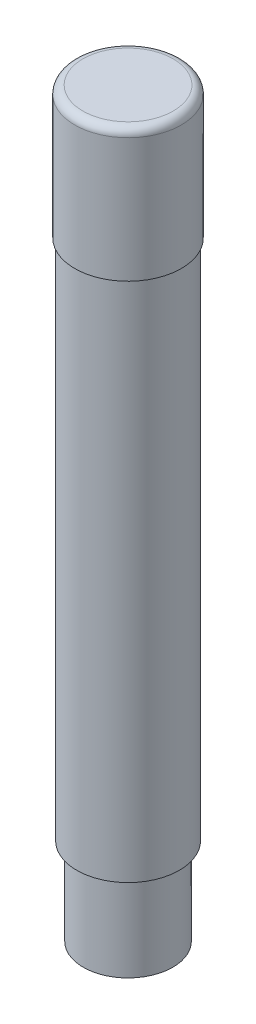
ISO-10303-21;
HEADER;
FILE_DESCRIPTION(('STEP AP214'),'2;1');
FILE_NAME('part.step','',(''),(''),'','','');
FILE_SCHEMA(('AUTOMOTIVE_DESIGN { 1 0 10303 214 1 1 1 1 }'));
ENDSEC;
DATA;
#1=APPLICATION_CONTEXT('core data for automotive mechanical design processes');
#2=APPLICATION_PROTOCOL_DEFINITION('international standard','automotive_design',2000,#1);
#3=PRODUCT_CONTEXT('',#1,'mechanical');
#4=PRODUCT('Part','Part','',(#3));
#5=PRODUCT_RELATED_PRODUCT_CATEGORY('part','',(#4));
#6=PRODUCT_DEFINITION_FORMATION('','',#4);
#7=PRODUCT_DEFINITION_CONTEXT('part definition',#1,'design');
#8=PRODUCT_DEFINITION('design','',#6,#7);
#9=PRODUCT_DEFINITION_SHAPE('','',#8);
#10=(LENGTH_UNIT() NAMED_UNIT(*) SI_UNIT(.MILLI.,.METRE.));
#11=(NAMED_UNIT(*) PLANE_ANGLE_UNIT() SI_UNIT($,.RADIAN.));
#12=(NAMED_UNIT(*) SI_UNIT($,.STERADIAN.) SOLID_ANGLE_UNIT());
#13=UNCERTAINTY_MEASURE_WITH_UNIT(LENGTH_MEASURE(1.E-05),#10,'distance_accuracy_value','');
#14=(GEOMETRIC_REPRESENTATION_CONTEXT(3) GLOBAL_UNCERTAINTY_ASSIGNED_CONTEXT((#13)) GLOBAL_UNIT_ASSIGNED_CONTEXT((#10,
#11,#12)) REPRESENTATION_CONTEXT('',''));
#15=CARTESIAN_POINT('',(0.,0.,0.));
#16=DIRECTION('',(0.,0.,1.));
#17=DIRECTION('',(1.,0.,0.));
#18=AXIS2_PLACEMENT_3D('',#15,#16,#17);
#19=CARTESIAN_POINT('',(-5.55,0.,0.));
#20=DIRECTION('',(0.,1.,0.));
#21=DIRECTION('',(0.,0.,1.));
#22=AXIS2_PLACEMENT_3D('',#19,#20,#21);
#23=PLANE('',#22);
#24=CARTESIAN_POINT('',(0.,0.,0.));
#25=DIRECTION('',(0.,-1.,0.));
#26=DIRECTION('',(0.,0.,-1.));
#27=AXIS2_PLACEMENT_3D('',#24,#25,#26);
#28=CIRCLE('',#27,5.55);
#29=CARTESIAN_POINT('',(0.,0.,-5.55));
#30=VERTEX_POINT('',#29);
#31=EDGE_CURVE('E75',#30,#30,#28,.T.);
#32=ORIENTED_EDGE('',*,*,#31,.T.);
#33=EDGE_LOOP('',(#32));
#34=FACE_BOUND('',#33,.T.);
#35=ADVANCED_FACE('F43',(#34),#23,.F.);
#36=CARTESIAN_POINT('',(0.,91.9,0.));
#37=DIRECTION('',(0.,-1.,0.));
#38=DIRECTION('',(0.,0.,-1.));
#39=AXIS2_PLACEMENT_3D('',#36,#37,#38);
#40=PLANE('',#39);
#41=CARTESIAN_POINT('',(0.,91.9,0.));
#42=DIRECTION('',(0.,-1.,0.));
#43=DIRECTION('',(0.,0.,-1.));
#44=AXIS2_PLACEMENT_3D('',#41,#42,#43);
#45=CIRCLE('',#44,5.6);
#46=CARTESIAN_POINT('',(0.,91.9,-5.6));
#47=VERTEX_POINT('',#46);
#48=EDGE_CURVE('E10',#47,#47,#45,.F.);
#49=ORIENTED_EDGE('',*,*,#48,.T.);
#50=EDGE_LOOP('',(#49));
#51=FACE_BOUND('',#50,.T.);
#52=ADVANCED_FACE('F107',(#51),#40,.F.);
#53=CARTESIAN_POINT('',(0.,0.,0.));
#54=DIRECTION('',(0.,-1.,0.));
#55=DIRECTION('',(0.,0.,-1.));
#56=AXIS2_PLACEMENT_3D('',#53,#54,#55);
#57=CYLINDRICAL_SURFACE('',#56,6.6);
#58=CARTESIAN_POINT('',(0.,90.9,0.));
#59=DIRECTION('',(0.,-1.,0.));
#60=DIRECTION('',(0.,0.,-1.));
#61=AXIS2_PLACEMENT_3D('',#58,#59,#60);
#62=CIRCLE('',#61,6.6);
#63=CARTESIAN_POINT('',(0.,90.9,-6.6));
#64=VERTEX_POINT('',#63);
#65=EDGE_CURVE('E51',#64,#64,#62,.T.);
#66=ORIENTED_EDGE('',*,*,#65,.T.);
#67=EDGE_LOOP('',(#66));
#68=FACE_BOUND('',#67,.T.);
#69=CARTESIAN_POINT('',(0.,75.5,0.));
#70=DIRECTION('',(0.,-1.,0.));
#71=DIRECTION('',(0.,0.,-1.));
#72=AXIS2_PLACEMENT_3D('',#69,#70,#71);
#73=CIRCLE('',#72,6.6);
#74=CARTESIAN_POINT('',(0.,75.5,-6.6));
#75=VERTEX_POINT('',#74);
#76=EDGE_CURVE('E56',#75,#75,#73,.T.);
#77=ORIENTED_EDGE('',*,*,#76,.F.);
#78=EDGE_LOOP('',(#77));
#79=FACE_BOUND('',#78,.T.);
#80=ADVANCED_FACE('F102',(#68,#79),#57,.T.);
#81=CARTESIAN_POINT('',(-6.6,75.5,0.));
#82=DIRECTION('',(0.,1.,0.));
#83=DIRECTION('',(0.,0.,1.));
#84=AXIS2_PLACEMENT_3D('',#81,#82,#83);
#85=PLANE('',#84);
#86=CARTESIAN_POINT('',(0.,75.5,0.));
#87=DIRECTION('',(0.,-1.,0.));
#88=DIRECTION('',(0.,0.,-1.));
#89=AXIS2_PLACEMENT_3D('',#86,#87,#88);
#90=CIRCLE('',#89,6.35);
#91=CARTESIAN_POINT('',(0.,75.5,-6.35));
#92=VERTEX_POINT('',#91);
#93=EDGE_CURVE('E61',#92,#92,#90,.T.);
#94=ORIENTED_EDGE('',*,*,#93,.F.);
#95=EDGE_LOOP('',(#94));
#96=FACE_BOUND('',#95,.T.);
#97=ORIENTED_EDGE('',*,*,#76,.T.);
#98=EDGE_LOOP('',(#97));
#99=FACE_BOUND('',#98,.T.);
#100=ADVANCED_FACE('F96',(#96,#99),#85,.F.);
#101=CARTESIAN_POINT('',(0.,0.,0.));
#102=DIRECTION('',(0.,-1.,0.));
#103=DIRECTION('',(0.,0.,-1.));
#104=AXIS2_PLACEMENT_3D('',#101,#102,#103);
#105=CYLINDRICAL_SURFACE('',#104,6.35);
#106=CARTESIAN_POINT('',(0.,10.8,0.));
#107=DIRECTION('',(0.,-1.,0.));
#108=DIRECTION('',(0.,0.,-1.));
#109=AXIS2_PLACEMENT_3D('',#106,#107,#108);
#110=CIRCLE('',#109,6.34999999999999);
#111=CARTESIAN_POINT('',(0.,10.8,-6.34999999999999));
#112=VERTEX_POINT('',#111);
#113=EDGE_CURVE('E67',#112,#112,#110,.T.);
#114=ORIENTED_EDGE('',*,*,#113,.F.);
#115=EDGE_LOOP('',(#114));
#116=FACE_BOUND('',#115,.T.);
#117=ORIENTED_EDGE('',*,*,#93,.T.);
#118=EDGE_LOOP('',(#117));
#119=FACE_BOUND('',#118,.T.);
#120=ADVANCED_FACE('F90',(#116,#119),#105,.T.);
#121=CARTESIAN_POINT('',(-6.34999999999999,10.8,0.));
#122=DIRECTION('',(0.,1.,0.));
#123=DIRECTION('',(0.,0.,1.));
#124=AXIS2_PLACEMENT_3D('',#121,#122,#123);
#125=PLANE('',#124);
#126=CARTESIAN_POINT('',(0.,10.8,0.));
#127=DIRECTION('',(0.,-1.,0.));
#128=DIRECTION('',(0.,0.,-1.));
#129=AXIS2_PLACEMENT_3D('',#126,#127,#128);
#130=CIRCLE('',#129,5.55);
#131=CARTESIAN_POINT('',(0.,10.8,-5.55));
#132=VERTEX_POINT('',#131);
#133=EDGE_CURVE('E71',#132,#132,#130,.T.);
#134=ORIENTED_EDGE('',*,*,#133,.F.);
#135=EDGE_LOOP('',(#134));
#136=FACE_BOUND('',#135,.T.);
#137=ORIENTED_EDGE('',*,*,#113,.T.);
#138=EDGE_LOOP('',(#137));
#139=FACE_BOUND('',#138,.T.);
#140=ADVANCED_FACE('F84',(#136,#139),#125,.F.);
#141=CARTESIAN_POINT('',(0.,0.,0.));
#142=DIRECTION('',(0.,-1.,0.));
#143=DIRECTION('',(0.,0.,-1.));
#144=AXIS2_PLACEMENT_3D('',#141,#142,#143);
#145=CYLINDRICAL_SURFACE('',#144,5.55);
#146=ORIENTED_EDGE('',*,*,#31,.F.);
#147=EDGE_LOOP('',(#146));
#148=FACE_BOUND('',#147,.T.);
#149=ORIENTED_EDGE('',*,*,#133,.T.);
#150=EDGE_LOOP('',(#149));
#151=FACE_BOUND('',#150,.T.);
#152=ADVANCED_FACE('F81',(#148,#151),#145,.T.);
#153=CARTESIAN_POINT('',(0.,90.9,0.));
#154=DIRECTION('',(0.,-1.,0.));
#155=DIRECTION('',(0.,0.,-1.));
#156=AXIS2_PLACEMENT_3D('',#153,#154,#155);
#157=TOROIDAL_SURFACE('',#156,5.6,1.);
#158=ORIENTED_EDGE('',*,*,#48,.F.);
#159=EDGE_LOOP('',(#158));
#160=FACE_BOUND('',#159,.T.);
#161=ORIENTED_EDGE('',*,*,#65,.F.);
#162=EDGE_LOOP('',(#161));
#163=FACE_BOUND('',#162,.T.);
#164=ADVANCED_FACE('F45',(#160,#163),#157,.T.);
#165=CLOSED_SHELL('',(#35,#52,#80,#100,#120,#140,#152,#164));
#166=MANIFOLD_SOLID_BREP('B2',#165);
#167=ADVANCED_BREP_SHAPE_REPRESENTATION('',(#18,#166),#14);
#168=SHAPE_DEFINITION_REPRESENTATION(#9,#167);
ENDSEC;
END-ISO-10303-21;
